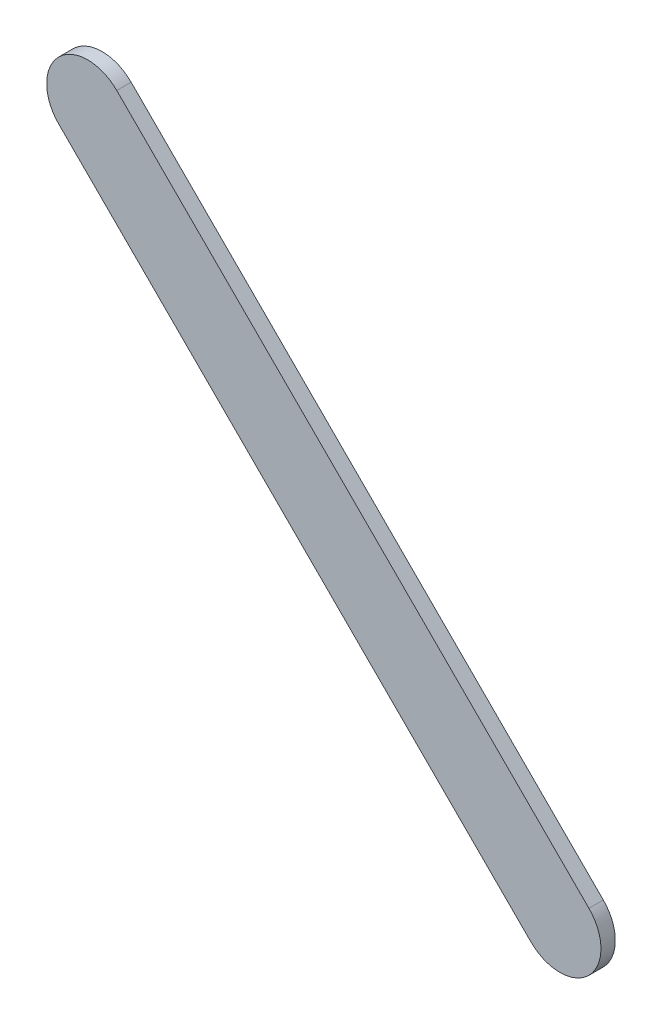
ISO-10303-21;
HEADER;
FILE_DESCRIPTION(('STEP AP214'),'2;1');
FILE_NAME('part.step','',(''),(''),'','','');
FILE_SCHEMA(('AUTOMOTIVE_DESIGN { 1 0 10303 214 1 1 1 1 }'));
ENDSEC;
DATA;
#1=APPLICATION_CONTEXT('core data for automotive mechanical design processes');
#2=APPLICATION_PROTOCOL_DEFINITION('international standard','automotive_design',2000,#1);
#3=PRODUCT_CONTEXT('',#1,'mechanical');
#4=PRODUCT('Part','Part','',(#3));
#5=PRODUCT_RELATED_PRODUCT_CATEGORY('part','',(#4));
#6=PRODUCT_DEFINITION_FORMATION('','',#4);
#7=PRODUCT_DEFINITION_CONTEXT('part definition',#1,'design');
#8=PRODUCT_DEFINITION('design','',#6,#7);
#9=PRODUCT_DEFINITION_SHAPE('','',#8);
#10=(LENGTH_UNIT() NAMED_UNIT(*) SI_UNIT(.MILLI.,.METRE.));
#11=(NAMED_UNIT(*) PLANE_ANGLE_UNIT() SI_UNIT($,.RADIAN.));
#12=(NAMED_UNIT(*) SI_UNIT($,.STERADIAN.) SOLID_ANGLE_UNIT());
#13=UNCERTAINTY_MEASURE_WITH_UNIT(LENGTH_MEASURE(1.E-05),#10,'distance_accuracy_value','');
#14=(GEOMETRIC_REPRESENTATION_CONTEXT(3) GLOBAL_UNCERTAINTY_ASSIGNED_CONTEXT((#13)) GLOBAL_UNIT_ASSIGNED_CONTEXT((#10,
#11,#12)) REPRESENTATION_CONTEXT('',''));
#15=CARTESIAN_POINT('',(0.,0.,0.));
#16=DIRECTION('',(0.,0.,1.));
#17=DIRECTION('',(1.,0.,0.));
#18=AXIS2_PLACEMENT_3D('',#15,#16,#17);
#19=CARTESIAN_POINT('',(82.879289,-119.92071,1.635));
#20=DIRECTION('',(0.,0.,1.));
#21=DIRECTION('',(1.,0.,0.));
#22=AXIS2_PLACEMENT_3D('',#19,#20,#21);
#23=PLANE('',#22);
#24=DIRECTION('',(0.707106781186548,-0.707106781186548,0.));
#25=VECTOR('',#24,1.);
#26=CARTESIAN_POINT('',(82.879289,-119.92071,1.635));
#27=LINE('',#26,#25);
#28=CARTESIAN_POINT('',(82.879289,-119.92071,1.635));
#29=VERTEX_POINT('',#28);
#30=CARTESIAN_POINT('',(84.029289,-121.07071,1.635));
#31=VERTEX_POINT('',#30);
#32=EDGE_CURVE('E81',#29,#31,#27,.T.);
#33=ORIENTED_EDGE('',*,*,#32,.T.);
#34=CARTESIAN_POINT('',(84.0999995,-120.9999995,1.635));
#35=DIRECTION('',(0.,0.,1.));
#36=DIRECTION('',(-0.707106781186048,-0.707106781187047,0.));
#37=AXIS2_PLACEMENT_3D('',#34,#35,#36);
#38=CIRCLE('',#37,0.09999974810219);
#39=CARTESIAN_POINT('',(84.17071,-120.929289,1.635));
#40=VERTEX_POINT('',#39);
#41=EDGE_CURVE('E105',#31,#40,#38,.T.);
#42=ORIENTED_EDGE('',*,*,#41,.T.);
#43=DIRECTION('',(-0.707106781186548,0.707106781186548,0.));
#44=VECTOR('',#43,1.);
#45=CARTESIAN_POINT('',(84.17071,-120.929289,1.635));
#46=LINE('',#45,#44);
#47=CARTESIAN_POINT('',(83.02071,-119.779289,1.635));
#48=VERTEX_POINT('',#47);
#49=EDGE_CURVE('E74',#40,#48,#46,.T.);
#50=ORIENTED_EDGE('',*,*,#49,.T.);
#51=CARTESIAN_POINT('',(82.9499995,-119.8499995,1.635));
#52=DIRECTION('',(0.,0.,1.));
#53=DIRECTION('',(0.707106781187048,0.707106781186048,0.));
#54=AXIS2_PLACEMENT_3D('',#51,#52,#53);
#55=CIRCLE('',#54,0.09999974810218);
#56=EDGE_CURVE('E11',#48,#29,#55,.T.);
#57=ORIENTED_EDGE('',*,*,#56,.T.);
#58=EDGE_LOOP('',(#33,#42,#50,#57));
#59=FACE_BOUND('',#58,.T.);
#60=ADVANCED_FACE('F17',(#59),#23,.T.);
#61=CARTESIAN_POINT('',(82.879289,-119.92071,1.6));
#62=DIRECTION('',(0.,0.,1.));
#63=DIRECTION('',(1.,0.,0.));
#64=AXIS2_PLACEMENT_3D('',#61,#62,#63);
#65=PLANE('',#64);
#66=CARTESIAN_POINT('',(82.9499995,-119.8499995,1.6));
#67=DIRECTION('',(0.,0.,1.));
#68=DIRECTION('',(0.707106781187048,0.707106781186048,0.));
#69=AXIS2_PLACEMENT_3D('',#66,#67,#68);
#70=CIRCLE('',#69,0.09999974810218);
#71=CARTESIAN_POINT('',(83.02071,-119.779289,1.6));
#72=VERTEX_POINT('',#71);
#73=CARTESIAN_POINT('',(82.879289,-119.92071,1.6));
#74=VERTEX_POINT('',#73);
#75=EDGE_CURVE('E25',#72,#74,#70,.T.);
#76=ORIENTED_EDGE('',*,*,#75,.F.);
#77=DIRECTION('',(-0.707106781186548,0.707106781186548,0.));
#78=VECTOR('',#77,1.);
#79=CARTESIAN_POINT('',(84.17071,-120.929289,1.6));
#80=LINE('',#79,#78);
#81=CARTESIAN_POINT('',(84.17071,-120.929289,1.6));
#82=VERTEX_POINT('',#81);
#83=EDGE_CURVE('E109',#82,#72,#80,.T.);
#84=ORIENTED_EDGE('',*,*,#83,.F.);
#85=CARTESIAN_POINT('',(84.0999995,-120.9999995,1.6));
#86=DIRECTION('',(0.,0.,1.));
#87=DIRECTION('',(-0.707106781186048,-0.707106781187047,0.));
#88=AXIS2_PLACEMENT_3D('',#85,#86,#87);
#89=CIRCLE('',#88,0.09999974810219);
#90=CARTESIAN_POINT('',(84.029289,-121.07071,1.6));
#91=VERTEX_POINT('',#90);
#92=EDGE_CURVE('E83',#91,#82,#89,.T.);
#93=ORIENTED_EDGE('',*,*,#92,.F.);
#94=DIRECTION('',(0.707106781186548,-0.707106781186548,0.));
#95=VECTOR('',#94,1.);
#96=CARTESIAN_POINT('',(82.879289,-119.92071,1.6));
#97=LINE('',#96,#95);
#98=EDGE_CURVE('E79',#74,#91,#97,.T.);
#99=ORIENTED_EDGE('',*,*,#98,.F.);
#100=EDGE_LOOP('',(#76,#84,#93,#99));
#101=FACE_BOUND('',#100,.T.);
#102=ADVANCED_FACE('F85',(#101),#65,.F.);
#103=CARTESIAN_POINT('',(82.9499995,-119.8499995,1.6));
#104=DIRECTION('',(0.,0.,-1.));
#105=DIRECTION('',(0.707106781187048,0.707106781186048,0.));
#106=AXIS2_PLACEMENT_3D('',#103,#104,#105);
#107=CYLINDRICAL_SURFACE('',#106,0.09999974810218);
#108=ORIENTED_EDGE('',*,*,#75,.T.);
#109=DIRECTION('',(0.,0.,1.));
#110=VECTOR('',#109,1.);
#111=CARTESIAN_POINT('',(82.879289,-119.92071,1.6));
#112=LINE('',#111,#110);
#113=EDGE_CURVE('E68',#74,#29,#112,.T.);
#114=ORIENTED_EDGE('',*,*,#113,.T.);
#115=ORIENTED_EDGE('',*,*,#56,.F.);
#116=DIRECTION('',(0.,0.,1.));
#117=VECTOR('',#116,1.);
#118=CARTESIAN_POINT('',(83.02071,-119.779289,1.6));
#119=LINE('',#118,#117);
#120=EDGE_CURVE('E71',#72,#48,#119,.T.);
#121=ORIENTED_EDGE('',*,*,#120,.F.);
#122=EDGE_LOOP('',(#108,#114,#115,#121));
#123=FACE_BOUND('',#122,.T.);
#124=ADVANCED_FACE('F67',(#123),#107,.T.);
#125=CARTESIAN_POINT('',(84.17071,-120.929289,1.6));
#126=DIRECTION('',(-0.707106781186548,-0.707106781186548,0.));
#127=DIRECTION('',(-0.707106781186548,0.707106781186548,0.));
#128=AXIS2_PLACEMENT_3D('',#125,#126,#127);
#129=PLANE('',#128);
#130=ORIENTED_EDGE('',*,*,#83,.T.);
#131=ORIENTED_EDGE('',*,*,#120,.T.);
#132=ORIENTED_EDGE('',*,*,#49,.F.);
#133=DIRECTION('',(0.,0.,1.));
#134=VECTOR('',#133,1.);
#135=CARTESIAN_POINT('',(84.17071,-120.929289,1.6));
#136=LINE('',#135,#134);
#137=EDGE_CURVE('E101',#82,#40,#136,.T.);
#138=ORIENTED_EDGE('',*,*,#137,.F.);
#139=EDGE_LOOP('',(#130,#131,#132,#138));
#140=FACE_BOUND('',#139,.T.);
#141=ADVANCED_FACE('F118',(#140),#129,.F.);
#142=CARTESIAN_POINT('',(84.0999995,-120.9999995,1.6));
#143=DIRECTION('',(0.,0.,-1.));
#144=DIRECTION('',(-0.707106781186048,-0.707106781187048,0.));
#145=AXIS2_PLACEMENT_3D('',#142,#143,#144);
#146=CYLINDRICAL_SURFACE('',#145,0.09999974810219);
#147=ORIENTED_EDGE('',*,*,#92,.T.);
#148=ORIENTED_EDGE('',*,*,#137,.T.);
#149=ORIENTED_EDGE('',*,*,#41,.F.);
#150=DIRECTION('',(0.,0.,1.));
#151=VECTOR('',#150,1.);
#152=CARTESIAN_POINT('',(84.029289,-121.07071,1.6));
#153=LINE('',#152,#151);
#154=EDGE_CURVE('E89',#91,#31,#153,.T.);
#155=ORIENTED_EDGE('',*,*,#154,.F.);
#156=EDGE_LOOP('',(#147,#148,#149,#155));
#157=FACE_BOUND('',#156,.T.);
#158=ADVANCED_FACE('F121',(#157),#146,.T.);
#159=CARTESIAN_POINT('',(82.879289,-119.92071,1.6));
#160=DIRECTION('',(0.707106781186548,0.707106781186548,0.));
#161=DIRECTION('',(0.,0.,-1.));
#162=AXIS2_PLACEMENT_3D('',#159,#160,#161);
#163=PLANE('',#162);
#164=ORIENTED_EDGE('',*,*,#98,.T.);
#165=ORIENTED_EDGE('',*,*,#154,.T.);
#166=ORIENTED_EDGE('',*,*,#32,.F.);
#167=ORIENTED_EDGE('',*,*,#113,.F.);
#168=EDGE_LOOP('',(#164,#165,#166,#167));
#169=FACE_BOUND('',#168,.T.);
#170=ADVANCED_FACE('F77',(#169),#163,.F.);
#171=CLOSED_SHELL('',(#60,#102,#124,#141,#158,#170));
#172=MANIFOLD_SOLID_BREP('B1',#171);
#173=ADVANCED_BREP_SHAPE_REPRESENTATION('',(#18,#172),#14);
#174=SHAPE_DEFINITION_REPRESENTATION(#9,#173);
ENDSEC;
END-ISO-10303-21;
